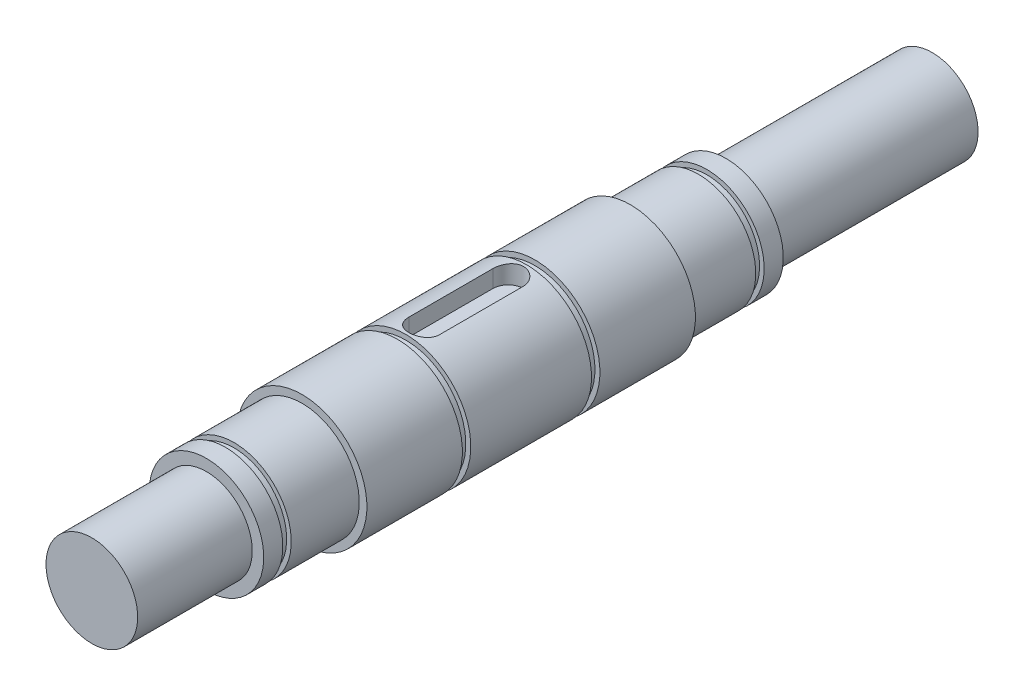
ISO-10303-21;
HEADER;
FILE_DESCRIPTION(('STEP AP214'),'2;1');
FILE_NAME('part.step','',(''),(''),'','','');
FILE_SCHEMA(('AUTOMOTIVE_DESIGN { 1 0 10303 214 1 1 1 1 }'));
ENDSEC;
DATA;
#1=APPLICATION_CONTEXT('core data for automotive mechanical design processes');
#2=APPLICATION_PROTOCOL_DEFINITION('international standard','automotive_design',2000,#1);
#3=PRODUCT_CONTEXT('',#1,'mechanical');
#4=PRODUCT('Part','Part','',(#3));
#5=PRODUCT_RELATED_PRODUCT_CATEGORY('part','',(#4));
#6=PRODUCT_DEFINITION_FORMATION('','',#4);
#7=PRODUCT_DEFINITION_CONTEXT('part definition',#1,'design');
#8=PRODUCT_DEFINITION('design','',#6,#7);
#9=PRODUCT_DEFINITION_SHAPE('','',#8);
#10=(LENGTH_UNIT() NAMED_UNIT(*) SI_UNIT(.MILLI.,.METRE.));
#11=(NAMED_UNIT(*) PLANE_ANGLE_UNIT() SI_UNIT($,.RADIAN.));
#12=(NAMED_UNIT(*) SI_UNIT($,.STERADIAN.) SOLID_ANGLE_UNIT());
#13=UNCERTAINTY_MEASURE_WITH_UNIT(LENGTH_MEASURE(1.E-05),#10,'distance_accuracy_value','');
#14=(GEOMETRIC_REPRESENTATION_CONTEXT(3) GLOBAL_UNCERTAINTY_ASSIGNED_CONTEXT((#13)) GLOBAL_UNIT_ASSIGNED_CONTEXT((#10,
#11,#12)) REPRESENTATION_CONTEXT('',''));
#15=CARTESIAN_POINT('',(0.,0.,0.));
#16=DIRECTION('',(0.,0.,1.));
#17=DIRECTION('',(1.,0.,0.));
#18=AXIS2_PLACEMENT_3D('',#15,#16,#17);
#19=CARTESIAN_POINT('',(0.,0.,61.));
#20=DIRECTION('',(0.,0.,-1.));
#21=DIRECTION('',(-1.,0.,0.));
#22=AXIS2_PLACEMENT_3D('',#19,#20,#21);
#23=CYLINDRICAL_SURFACE('',#22,8.5);
#24=DIRECTION('',(0.,0.,-1.));
#25=VECTOR('',#24,1.);
#26=CARTESIAN_POINT('',(2.00000000000001,8.26135582092915,61.));
#27=LINE('',#26,#25);
#28=CARTESIAN_POINT('',(2.,8.26135582092915,-5.5));
#29=VERTEX_POINT('',#28);
#30=CARTESIAN_POINT('',(2.,8.26135582092915,5.5));
#31=VERTEX_POINT('',#30);
#32=EDGE_CURVE('E11',#29,#31,#27,.F.);
#33=ORIENTED_EDGE('',*,*,#32,.T.);
#34=CARTESIAN_POINT('',(2.,8.26135582092915,5.5));
#35=CARTESIAN_POINT('',(2.00000055504916,8.26135236320292,5.55543443234609));
#36=CARTESIAN_POINT('',(1.99769380139236,8.2619144856103,5.61084150880542));
#37=CARTESIAN_POINT('',(1.98849731170137,8.264134056541,5.72124343398645));
#38=CARTESIAN_POINT('',(1.98160828133566,8.26579133641032,5.77623834486291));
#39=CARTESIAN_POINT('',(1.95416393612277,8.27234056234883,5.9397976249519));
#40=CARTESIAN_POINT('',(1.92683096321235,8.27881027991498,6.04724147136273));
#41=CARTESIAN_POINT('',(1.85496116677948,8.29520698466521,6.25585034596174));
#42=CARTESIAN_POINT('',(1.81042483664592,8.30513387269752,6.35701555412345));
#43=CARTESIAN_POINT('',(1.70546046419011,8.32732086336626,6.55048295176043));
#44=CARTESIAN_POINT('',(1.6450289846229,8.33958147049888,6.6427832183367));
#45=CARTESIAN_POINT('',(1.50874637759438,8.36531906602219,6.81764453044756));
#46=CARTESIAN_POINT('',(1.43264491321001,8.37881352706603,6.90000784641861));
#47=CARTESIAN_POINT('',(1.26771483694585,8.40534737590744,7.05093390496734));
#48=CARTESIAN_POINT('',(1.17888421755235,8.41838669151993,7.11949446660463));
#49=CARTESIAN_POINT('',(0.989672002747234,8.442733227235,7.24166094949367));
#50=CARTESIAN_POINT('',(0.889162184224322,8.45401726068056,7.2950732925612));
#51=CARTESIAN_POINT('',(0.680287309391546,8.47338148505523,7.38416960356757));
#52=CARTESIAN_POINT('',(0.571923680419546,8.48146225642124,7.41985678363482));
#53=CARTESIAN_POINT('',(0.352485313548638,8.49338596556868,7.47186163105777));
#54=CARTESIAN_POINT('',(0.241494636223669,8.49730265616028,7.48851679926374));
#55=CARTESIAN_POINT('',(0.0182275662118413,8.50071323920615,7.50304234200866));
#56=CARTESIAN_POINT('',(-0.0940486848647882,8.50020761420044,7.50091476602244));
#57=CARTESIAN_POINT('',(-0.314360678706203,8.49488597842209,7.47818142541676));
#58=CARTESIAN_POINT('',(-0.422436389839885,8.490154991221,7.45794013277813));
#59=CARTESIAN_POINT('',(-0.633611361576782,8.47701221926345,7.40013751637648));
#60=CARTESIAN_POINT('',(-0.736710417304362,8.46860028311536,7.36257548023524));
#61=CARTESIAN_POINT('',(-0.935993037737948,8.44890733460507,7.27088898107256));
#62=CARTESIAN_POINT('',(-1.03211256730711,8.43760323594277,7.21663049906744));
#63=CARTESIAN_POINT('',(-1.21400998738323,8.41335915429893,7.09319328328421));
#64=CARTESIAN_POINT('',(-1.29978653304345,8.40041895903104,7.02401261250253));
#65=CARTESIAN_POINT('',(-1.46072775473717,8.37395331213205,6.87073568992401));
#66=CARTESIAN_POINT('',(-1.53558950612902,8.36042126513727,6.78632223219044));
#67=CARTESIAN_POINT('',(-1.67017505039283,8.33458019092887,6.60597239998216));
#68=CARTESIAN_POINT('',(-1.72989470920645,8.32227149826905,6.51003288920577));
#69=CARTESIAN_POINT('',(-1.8326691841855,8.30024752435885,6.30879607738306));
#70=CARTESIAN_POINT('',(-1.87564929064842,8.29054392828406,6.20345934644367));
#71=CARTESIAN_POINT('',(-1.94314531697339,8.27498678101182,5.98683803286428));
#72=CARTESIAN_POINT('',(-1.96768876833645,8.26912749076621,5.87556258575516));
#73=CARTESIAN_POINT('',(-1.98841329263761,8.26415363873449,5.71945500793536));
#74=CARTESIAN_POINT('',(-1.99275932156623,8.26310592036969,5.67564612687529));
#75=CARTESIAN_POINT('',(-1.99854927861069,8.2617074132624,5.58789832699884));
#76=CARTESIAN_POINT('',(-1.99999797058451,8.26135548050657,5.54395974080035));
#77=CARTESIAN_POINT('',(-2.,8.26135582092915,5.5));
#78=B_SPLINE_CURVE_WITH_KNOTS('',3,(#34,#35,#36,#37,#38,#39,#40,#41,#42,#43,#44,#45,#46,#47,#48,
#49,#50,#51,#52,#53,#54,#55,#56,#57,#58,#59,#60,#61,#62,#63,#64,#65,#66,#67,#68,#69,#70,#71,#72,
#73,#74,#75,#76,#77),.UNSPECIFIED.,.F.,.F.,(4,2,2,2,2,2,2,2,2,2,2,2,2,2,2,2,2,2,2,2,2,4),(0.,
0.16619859764889,0.332371606715107,0.663814743733817,0.995248375734669,1.32675373757508,
1.66403554066599,2.00137059509772,2.34283993997873,2.6842473816804,3.01950170621968,
3.35471945001224,3.68334015893415,4.01197438477705,4.34331851400087,4.67470567990144,
5.01401985792581,5.35342657519617,5.69433118783424,6.03472570922612,6.1667548355018,
6.29856669785088),.UNSPECIFIED.);
#79=CARTESIAN_POINT('',(-2.,8.26135582092915,5.5));
#80=VERTEX_POINT('',#79);
#81=EDGE_CURVE('E183',#31,#80,#78,.T.);
#82=ORIENTED_EDGE('',*,*,#81,.T.);
#83=DIRECTION('',(0.,0.,-1.));
#84=VECTOR('',#83,1.);
#85=CARTESIAN_POINT('',(-1.99999999999999,8.26135582092915,61.));
#86=LINE('',#85,#84);
#87=CARTESIAN_POINT('',(-1.99999999999999,8.26135582092915,-5.50000000000001));
#88=VERTEX_POINT('',#87);
#89=EDGE_CURVE('E44',#80,#88,#86,.T.);
#90=ORIENTED_EDGE('',*,*,#89,.T.);
#91=CARTESIAN_POINT('',(-2.,8.26135582092915,-5.5));
#92=CARTESIAN_POINT('',(-2.00000055504917,8.26135236320292,-5.55543443234609));
#93=CARTESIAN_POINT('',(-1.99769380139237,8.2619144856103,-5.61084150880542));
#94=CARTESIAN_POINT('',(-1.98849731170137,8.264134056541,-5.72124343398645));
#95=CARTESIAN_POINT('',(-1.98160828133566,8.26579133641032,-5.77623834486291));
#96=CARTESIAN_POINT('',(-1.95416393612277,8.27234056234883,-5.9397976249519));
#97=CARTESIAN_POINT('',(-1.92683096321235,8.27881027991498,-6.04724147136273));
#98=CARTESIAN_POINT('',(-1.85496116677948,8.29520698466521,-6.25585034596174));
#99=CARTESIAN_POINT('',(-1.81042483664592,8.30513387269752,-6.35701555412345));
#100=CARTESIAN_POINT('',(-1.70546046419011,8.32732086336626,-6.55048295176042));
#101=CARTESIAN_POINT('',(-1.6450289846229,8.33958147049889,-6.6427832183367));
#102=CARTESIAN_POINT('',(-1.50874637759439,8.36531906602219,-6.81764453044755));
#103=CARTESIAN_POINT('',(-1.43264491321001,8.37881352706603,-6.90000784641861));
#104=CARTESIAN_POINT('',(-1.26771483694585,8.40534737590744,-7.05093390496734));
#105=CARTESIAN_POINT('',(-1.17888421755235,8.41838669151993,-7.11949446660463));
#106=CARTESIAN_POINT('',(-0.989672002747238,8.442733227235,-7.24166094949367));
#107=CARTESIAN_POINT('',(-0.889162184224326,8.45401726068056,-7.2950732925612));
#108=CARTESIAN_POINT('',(-0.680287309391551,8.47338148505523,-7.38416960356757));
#109=CARTESIAN_POINT('',(-0.57192368041955,8.48146225642124,-7.41985678363482));
#110=CARTESIAN_POINT('',(-0.352485313548643,8.49338596556868,-7.47186163105777));
#111=CARTESIAN_POINT('',(-0.241494636223674,8.49730265616028,-7.48851679926374));
#112=CARTESIAN_POINT('',(-0.0182275662118457,8.50071323920615,-7.50304234200866));
#113=CARTESIAN_POINT('',(0.0940486848647839,8.50020761420044,-7.50091476602244));
#114=CARTESIAN_POINT('',(0.314360678706199,8.49488597842209,-7.47818142541676));
#115=CARTESIAN_POINT('',(0.422436389839881,8.490154991221,-7.45794013277813));
#116=CARTESIAN_POINT('',(0.633611361576779,8.47701221926345,-7.40013751637648));
#117=CARTESIAN_POINT('',(0.736710417304359,8.46860028311537,-7.36257548023524));
#118=CARTESIAN_POINT('',(0.935993037737945,8.44890733460507,-7.27088898107256));
#119=CARTESIAN_POINT('',(1.03211256730711,8.43760323594277,-7.21663049906744));
#120=CARTESIAN_POINT('',(1.21400998738322,8.41335915429893,-7.09319328328421));
#121=CARTESIAN_POINT('',(1.29978653304345,8.40041895903104,-7.02401261250254));
#122=CARTESIAN_POINT('',(1.46072775473717,8.37395331213205,-6.87073568992401));
#123=CARTESIAN_POINT('',(1.53558950612902,8.36042126513727,-6.78632223219044));
#124=CARTESIAN_POINT('',(1.67017505039282,8.33458019092887,-6.60597239998216));
#125=CARTESIAN_POINT('',(1.72989470920644,8.32227149826905,-6.51003288920578));
#126=CARTESIAN_POINT('',(1.8326691841855,8.30024752435885,-6.30879607738307));
#127=CARTESIAN_POINT('',(1.87564929064842,8.29054392828406,-6.20345934644367));
#128=CARTESIAN_POINT('',(1.94314531697339,8.27498678101182,-5.98683803286428));
#129=CARTESIAN_POINT('',(1.96768876833644,8.26912749076621,-5.87556258575516));
#130=CARTESIAN_POINT('',(1.9884132926376,8.26415363873449,-5.71945500793537));
#131=CARTESIAN_POINT('',(1.99275932156623,8.26310592036969,-5.67564612687529));
#132=CARTESIAN_POINT('',(1.99854927861069,8.2617074132624,-5.58789832699884));
#133=CARTESIAN_POINT('',(1.99999797058451,8.26135548050657,-5.54395974080035));
#134=CARTESIAN_POINT('',(2.,8.26135582092915,-5.5));
#135=B_SPLINE_CURVE_WITH_KNOTS('',3,(#91,#92,#93,#94,#95,#96,#97,#98,#99,#100,#101,#102,#103,
#104,#105,#106,#107,#108,#109,#110,#111,#112,#113,#114,#115,#116,#117,#118,#119,#120,#121,#122,
#123,#124,#125,#126,#127,#128,#129,#130,#131,#132,#133,#134),.UNSPECIFIED.,.F.,.F.,(4,2,2,2,2,2,
2,2,2,2,2,2,2,2,2,2,2,2,2,2,2,4),(0.,0.166198597648889,0.332371606715107,0.663814743733816,
0.995248375734668,1.32675373757507,1.66403554066599,2.00137059509772,2.34283993997873,
2.6842473816804,3.01950170621968,3.35471945001224,3.68334015893415,4.01197438477705,
4.34331851400087,4.67470567990144,5.01401985792581,5.35342657519617,5.69433118783423,
6.03472570922612,6.16675483550179,6.29856669785088),.UNSPECIFIED.);
#136=EDGE_CURVE('E51',#88,#29,#135,.T.);
#137=ORIENTED_EDGE('',*,*,#136,.T.);
#138=EDGE_LOOP('',(#33,#82,#90,#137));
#139=FACE_BOUND('',#138,.T.);
#140=CARTESIAN_POINT('',(0.,0.,7.9));
#141=DIRECTION('',(0.,0.,-1.));
#142=DIRECTION('',(-1.,0.,0.));
#143=AXIS2_PLACEMENT_3D('',#140,#141,#142);
#144=CIRCLE('',#143,8.5);
#145=CARTESIAN_POINT('',(-8.5,0.,7.9));
#146=VERTEX_POINT('',#145);
#147=EDGE_CURVE('E102',#146,#146,#144,.T.);
#148=ORIENTED_EDGE('',*,*,#147,.T.);
#149=EDGE_LOOP('',(#148));
#150=FACE_BOUND('',#149,.T.);
#151=CARTESIAN_POINT('',(0.,0.,-7.9));
#152=DIRECTION('',(0.,0.,-1.));
#153=DIRECTION('',(-1.,0.,0.));
#154=AXIS2_PLACEMENT_3D('',#151,#152,#153);
#155=CIRCLE('',#154,8.5);
#156=CARTESIAN_POINT('',(-8.5,0.,-7.9));
#157=VERTEX_POINT('',#156);
#158=EDGE_CURVE('E117',#157,#157,#155,.T.);
#159=ORIENTED_EDGE('',*,*,#158,.F.);
#160=EDGE_LOOP('',(#159));
#161=FACE_BOUND('',#160,.T.);
#162=ADVANCED_FACE('F35',(#139,#150,#161),#23,.T.);
#163=CARTESIAN_POINT('',(0.,8.5,-7.9));
#164=DIRECTION('',(0.,0.,1.));
#165=DIRECTION('',(1.,0.,0.));
#166=AXIS2_PLACEMENT_3D('',#163,#164,#165);
#167=PLANE('',#166);
#168=CARTESIAN_POINT('',(0.,0.,-7.9));
#169=DIRECTION('',(0.,0.,-1.));
#170=DIRECTION('',(-1.,0.,0.));
#171=AXIS2_PLACEMENT_3D('',#168,#169,#170);
#172=CIRCLE('',#171,7.85);
#173=CARTESIAN_POINT('',(-7.85,0.,-7.9));
#174=VERTEX_POINT('',#173);
#175=EDGE_CURVE('E126',#174,#174,#172,.T.);
#176=ORIENTED_EDGE('',*,*,#175,.F.);
#177=EDGE_LOOP('',(#176));
#178=FACE_BOUND('',#177,.T.);
#179=ORIENTED_EDGE('',*,*,#158,.T.);
#180=EDGE_LOOP('',(#179));
#181=FACE_BOUND('',#180,.T.);
#182=ADVANCED_FACE('F232',(#178,#181),#167,.F.);
#183=CARTESIAN_POINT('',(0.,0.,-67.1));
#184=DIRECTION('',(0.,0.,-1.));
#185=DIRECTION('',(-1.,0.,0.));
#186=AXIS2_PLACEMENT_3D('',#183,#184,#185);
#187=CYLINDRICAL_SURFACE('',#186,7.85);
#188=CARTESIAN_POINT('',(0.,0.,-8.99999999999999));
#189=DIRECTION('',(0.,0.,-1.));
#190=DIRECTION('',(-1.,0.,0.));
#191=AXIS2_PLACEMENT_3D('',#188,#189,#190);
#192=CIRCLE('',#191,7.85);
#193=CARTESIAN_POINT('',(-7.85,0.,-8.99999999999999));
#194=VERTEX_POINT('',#193);
#195=EDGE_CURVE('E123',#194,#194,#192,.T.);
#196=ORIENTED_EDGE('',*,*,#195,.F.);
#197=EDGE_LOOP('',(#196));
#198=FACE_BOUND('',#197,.T.);
#199=ORIENTED_EDGE('',*,*,#175,.T.);
#200=EDGE_LOOP('',(#199));
#201=FACE_BOUND('',#200,.T.);
#202=ADVANCED_FACE('F228',(#198,#201),#187,.T.);
#203=CARTESIAN_POINT('',(0.,8.5,-9.));
#204=DIRECTION('',(0.,0.,-1.));
#205=DIRECTION('',(-1.,0.,0.));
#206=AXIS2_PLACEMENT_3D('',#203,#204,#205);
#207=PLANE('',#206);
#208=CARTESIAN_POINT('',(0.,0.,-8.99999999999999));
#209=DIRECTION('',(0.,0.,-1.));
#210=DIRECTION('',(-1.,0.,0.));
#211=AXIS2_PLACEMENT_3D('',#208,#209,#210);
#212=CIRCLE('',#211,8.5);
#213=CARTESIAN_POINT('',(-8.5,0.,-8.99999999999999));
#214=VERTEX_POINT('',#213);
#215=EDGE_CURVE('E120',#214,#214,#212,.T.);
#216=ORIENTED_EDGE('',*,*,#215,.F.);
#217=EDGE_LOOP('',(#216));
#218=FACE_BOUND('',#217,.T.);
#219=ORIENTED_EDGE('',*,*,#195,.T.);
#220=EDGE_LOOP('',(#219));
#221=FACE_BOUND('',#220,.T.);
#222=ADVANCED_FACE('F224',(#218,#221),#207,.F.);
#223=CARTESIAN_POINT('',(0.,0.,-61.));
#224=DIRECTION('',(0.,0.,1.));
#225=DIRECTION('',(1.,0.,0.));
#226=AXIS2_PLACEMENT_3D('',#223,#224,#225);
#227=PLANE('',#226);
#228=CARTESIAN_POINT('',(0.,0.,-61.));
#229=DIRECTION('',(0.,0.,-1.));
#230=DIRECTION('',(-1.,0.,0.));
#231=AXIS2_PLACEMENT_3D('',#228,#229,#230);
#232=CIRCLE('',#231,6.);
#233=CARTESIAN_POINT('',(-6.,0.,-61.));
#234=VERTEX_POINT('',#233);
#235=EDGE_CURVE('E162',#234,#234,#232,.T.);
#236=ORIENTED_EDGE('',*,*,#235,.T.);
#237=EDGE_LOOP('',(#236));
#238=FACE_BOUND('',#237,.T.);
#239=ADVANCED_FACE('F227',(#238),#227,.F.);
#240=CARTESIAN_POINT('',(0.,0.,-67.1));
#241=DIRECTION('',(0.,0.,-1.));
#242=DIRECTION('',(-1.,0.,0.));
#243=AXIS2_PLACEMENT_3D('',#240,#241,#242);
#244=CYLINDRICAL_SURFACE('',#243,6.);
#245=ORIENTED_EDGE('',*,*,#235,.F.);
#246=EDGE_LOOP('',(#245));
#247=FACE_BOUND('',#246,.T.);
#248=CARTESIAN_POINT('',(0.,0.,-34.));
#249=DIRECTION('',(0.,0.,-1.));
#250=DIRECTION('',(-1.,0.,0.));
#251=AXIS2_PLACEMENT_3D('',#248,#249,#250);
#252=CIRCLE('',#251,6.);
#253=CARTESIAN_POINT('',(-6.,0.,-34.));
#254=VERTEX_POINT('',#253);
#255=EDGE_CURVE('E165',#254,#254,#252,.T.);
#256=ORIENTED_EDGE('',*,*,#255,.T.);
#257=EDGE_LOOP('',(#256));
#258=FACE_BOUND('',#257,.T.);
#259=ADVANCED_FACE('F272',(#247,#258),#244,.T.);
#260=CARTESIAN_POINT('',(0.,7.5,-34.));
#261=DIRECTION('',(0.,0.,1.));
#262=DIRECTION('',(1.,0.,0.));
#263=AXIS2_PLACEMENT_3D('',#260,#261,#262);
#264=PLANE('',#263);
#265=ORIENTED_EDGE('',*,*,#255,.F.);
#266=EDGE_LOOP('',(#265));
#267=FACE_BOUND('',#266,.T.);
#268=CARTESIAN_POINT('',(0.,0.,-34.));
#269=DIRECTION('',(0.,0.,-1.));
#270=DIRECTION('',(-1.,0.,0.));
#271=AXIS2_PLACEMENT_3D('',#268,#269,#270);
#272=CIRCLE('',#271,7.5);
#273=CARTESIAN_POINT('',(-7.5,0.,-34.));
#274=VERTEX_POINT('',#273);
#275=EDGE_CURVE('E159',#274,#274,#272,.T.);
#276=ORIENTED_EDGE('',*,*,#275,.T.);
#277=EDGE_LOOP('',(#276));
#278=FACE_BOUND('',#277,.T.);
#279=ADVANCED_FACE('F275',(#267,#278),#264,.F.);
#280=CARTESIAN_POINT('',(0.,0.,-67.1));
#281=DIRECTION('',(0.,0.,-1.));
#282=DIRECTION('',(-1.,0.,0.));
#283=AXIS2_PLACEMENT_3D('',#280,#281,#282);
#284=CYLINDRICAL_SURFACE('',#283,7.5);
#285=CARTESIAN_POINT('',(0.,0.,-31.5));
#286=DIRECTION('',(0.,0.,-1.));
#287=DIRECTION('',(-1.,0.,0.));
#288=AXIS2_PLACEMENT_3D('',#285,#286,#287);
#289=CIRCLE('',#288,7.5);
#290=CARTESIAN_POINT('',(-7.5,0.,-31.5));
#291=VERTEX_POINT('',#290);
#292=EDGE_CURVE('E144',#291,#291,#289,.T.);
#293=ORIENTED_EDGE('',*,*,#292,.T.);
#294=EDGE_LOOP('',(#293));
#295=FACE_BOUND('',#294,.T.);
#296=ORIENTED_EDGE('',*,*,#275,.F.);
#297=EDGE_LOOP('',(#296));
#298=FACE_BOUND('',#297,.T.);
#299=ADVANCED_FACE('F255',(#295,#298),#284,.T.);
#300=CARTESIAN_POINT('',(0.,7.5,-31.5));
#301=DIRECTION('',(0.,0.,-1.));
#302=DIRECTION('',(-1.,0.,0.));
#303=AXIS2_PLACEMENT_3D('',#300,#301,#302);
#304=PLANE('',#303);
#305=ORIENTED_EDGE('',*,*,#292,.F.);
#306=EDGE_LOOP('',(#305));
#307=FACE_BOUND('',#306,.T.);
#308=CARTESIAN_POINT('',(0.,0.,-31.5));
#309=DIRECTION('',(0.,0.,-1.));
#310=DIRECTION('',(-1.,0.,0.));
#311=AXIS2_PLACEMENT_3D('',#308,#309,#310);
#312=CIRCLE('',#311,6.9);
#313=CARTESIAN_POINT('',(-6.9,0.,-31.5));
#314=VERTEX_POINT('',#313);
#315=EDGE_CURVE('E147',#314,#314,#312,.T.);
#316=ORIENTED_EDGE('',*,*,#315,.T.);
#317=EDGE_LOOP('',(#316));
#318=FACE_BOUND('',#317,.T.);
#319=ADVANCED_FACE('F251',(#307,#318),#304,.F.);
#320=CARTESIAN_POINT('',(0.,0.,-67.1));
#321=DIRECTION('',(0.,0.,-1.));
#322=DIRECTION('',(-1.,0.,0.));
#323=AXIS2_PLACEMENT_3D('',#320,#321,#322);
#324=CYLINDRICAL_SURFACE('',#323,6.9);
#325=ORIENTED_EDGE('',*,*,#315,.F.);
#326=EDGE_LOOP('',(#325));
#327=FACE_BOUND('',#326,.T.);
#328=CARTESIAN_POINT('',(0.,0.,-30.4));
#329=DIRECTION('',(0.,0.,-1.));
#330=DIRECTION('',(-1.,0.,0.));
#331=AXIS2_PLACEMENT_3D('',#328,#329,#330);
#332=CIRCLE('',#331,6.9);
#333=CARTESIAN_POINT('',(-6.9,0.,-30.4));
#334=VERTEX_POINT('',#333);
#335=EDGE_CURVE('E150',#334,#334,#332,.T.);
#336=ORIENTED_EDGE('',*,*,#335,.T.);
#337=EDGE_LOOP('',(#336));
#338=FACE_BOUND('',#337,.T.);
#339=ADVANCED_FACE('F254',(#327,#338),#324,.T.);
#340=CARTESIAN_POINT('',(0.,7.5,-30.4));
#341=DIRECTION('',(0.,0.,1.));
#342=DIRECTION('',(1.,0.,0.));
#343=AXIS2_PLACEMENT_3D('',#340,#341,#342);
#344=PLANE('',#343);
#345=ORIENTED_EDGE('',*,*,#335,.F.);
#346=EDGE_LOOP('',(#345));
#347=FACE_BOUND('',#346,.T.);
#348=CARTESIAN_POINT('',(0.,0.,-30.4));
#349=DIRECTION('',(0.,0.,-1.));
#350=DIRECTION('',(-1.,0.,0.));
#351=AXIS2_PLACEMENT_3D('',#348,#349,#350);
#352=CIRCLE('',#351,7.5);
#353=CARTESIAN_POINT('',(-7.5,0.,-30.4));
#354=VERTEX_POINT('',#353);
#355=EDGE_CURVE('E141',#354,#354,#352,.T.);
#356=ORIENTED_EDGE('',*,*,#355,.T.);
#357=EDGE_LOOP('',(#356));
#358=FACE_BOUND('',#357,.T.);
#359=ADVANCED_FACE('F259',(#347,#358),#344,.F.);
#360=ORIENTED_EDGE('',*,*,#355,.F.);
#361=EDGE_LOOP('',(#360));
#362=FACE_BOUND('',#361,.T.);
#363=CARTESIAN_POINT('',(0.,0.,-21.5));
#364=DIRECTION('',(0.,0.,-1.));
#365=DIRECTION('',(-1.,0.,0.));
#366=AXIS2_PLACEMENT_3D('',#363,#364,#365);
#367=CIRCLE('',#366,7.5);
#368=CARTESIAN_POINT('',(-7.5,0.,-21.5));
#369=VERTEX_POINT('',#368);
#370=EDGE_CURVE('E177',#369,#369,#367,.T.);
#371=ORIENTED_EDGE('',*,*,#370,.T.);
#372=EDGE_LOOP('',(#371));
#373=FACE_BOUND('',#372,.T.);
#374=ADVANCED_FACE('F263',(#362,#373),#284,.T.);
#375=CARTESIAN_POINT('',(0.,8.5,-21.5));
#376=DIRECTION('',(0.,0.,1.));
#377=DIRECTION('',(1.,0.,0.));
#378=AXIS2_PLACEMENT_3D('',#375,#376,#377);
#379=PLANE('',#378);
#380=ORIENTED_EDGE('',*,*,#370,.F.);
#381=EDGE_LOOP('',(#380));
#382=FACE_BOUND('',#381,.T.);
#383=CARTESIAN_POINT('',(0.,0.,-21.5));
#384=DIRECTION('',(0.,0.,-1.));
#385=DIRECTION('',(-1.,0.,0.));
#386=AXIS2_PLACEMENT_3D('',#383,#384,#385);
#387=CIRCLE('',#386,8.5);
#388=CARTESIAN_POINT('',(-8.5,0.,-21.5));
#389=VERTEX_POINT('',#388);
#390=EDGE_CURVE('E174',#389,#389,#387,.T.);
#391=ORIENTED_EDGE('',*,*,#390,.T.);
#392=EDGE_LOOP('',(#391));
#393=FACE_BOUND('',#392,.T.);
#394=ADVANCED_FACE('F290',(#382,#393),#379,.F.);
#395=CARTESIAN_POINT('',(-8.5,0.,-8.99999999999999));
#396=CARTESIAN_POINT('',(-8.5,0.,-9.13020833333333));
#397=CARTESIAN_POINT('',(-8.5,0.,-9.26041666666666));
#398=CARTESIAN_POINT('',(-8.5,0.,-9.52083333333333));
#399=CARTESIAN_POINT('',(-8.5,0.,-9.65104166666666));
#400=CARTESIAN_POINT('',(-8.5,0.,-9.91145833333333));
#401=CARTESIAN_POINT('',(-8.5,0.,-10.0416666666667));
#402=CARTESIAN_POINT('',(-8.5,0.,-10.3020833333333));
#403=CARTESIAN_POINT('',(-8.5,0.,-10.4322916666667));
#404=CARTESIAN_POINT('',(-8.5,0.,-10.6927083333333));
#405=CARTESIAN_POINT('',(-8.5,0.,-10.8229166666667));
#406=CARTESIAN_POINT('',(-8.5,0.,-11.0833333333333));
#407=CARTESIAN_POINT('',(-8.5,0.,-11.2135416666667));
#408=CARTESIAN_POINT('',(-8.5,0.,-11.4739583333333));
#409=CARTESIAN_POINT('',(-8.5,0.,-11.6041666666667));
#410=CARTESIAN_POINT('',(-8.5,0.,-11.8645833333333));
#411=CARTESIAN_POINT('',(-8.5,0.,-11.9947916666667));
#412=CARTESIAN_POINT('',(-8.5,0.,-12.2552083333333));
#413=CARTESIAN_POINT('',(-8.5,0.,-12.3854166666667));
#414=CARTESIAN_POINT('',(-8.5,0.,-12.6458333333333));
#415=CARTESIAN_POINT('',(-8.5,0.,-12.7760416666667));
#416=CARTESIAN_POINT('',(-8.5,0.,-13.0364583333333));
#417=CARTESIAN_POINT('',(-8.5,0.,-13.1666666666667));
#418=CARTESIAN_POINT('',(-8.5,0.,-13.4270833333333));
#419=CARTESIAN_POINT('',(-8.5,0.,-13.5572916666667));
#420=CARTESIAN_POINT('',(-8.5,0.,-13.8177083333333));
#421=CARTESIAN_POINT('',(-8.5,0.,-13.9479166666667));
#422=CARTESIAN_POINT('',(-8.5,0.,-14.2083333333333));
#423=CARTESIAN_POINT('',(-8.5,0.,-14.3385416666667));
#424=CARTESIAN_POINT('',(-8.5,0.,-14.5989583333333));
#425=CARTESIAN_POINT('',(-8.5,0.,-14.7291666666667));
#426=CARTESIAN_POINT('',(-8.5,0.,-14.9895833333333));
#427=CARTESIAN_POINT('',(-8.5,0.,-15.1197916666667));
#428=CARTESIAN_POINT('',(-8.5,0.,-15.3802083333333));
#429=CARTESIAN_POINT('',(-8.5,0.,-15.5104166666667));
#430=CARTESIAN_POINT('',(-8.5,0.,-15.7708333333333));
#431=CARTESIAN_POINT('',(-8.5,0.,-15.9010416666667));
#432=CARTESIAN_POINT('',(-8.5,0.,-16.1614583333333));
#433=CARTESIAN_POINT('',(-8.5,0.,-16.2916666666667));
#434=CARTESIAN_POINT('',(-8.5,0.,-16.5520833333333));
#435=CARTESIAN_POINT('',(-8.5,0.,-16.6822916666667));
#436=CARTESIAN_POINT('',(-8.5,0.,-16.9427083333333));
#437=CARTESIAN_POINT('',(-8.5,0.,-17.0729166666667));
#438=CARTESIAN_POINT('',(-8.5,0.,-17.3333333333333));
#439=CARTESIAN_POINT('',(-8.5,0.,-17.4635416666667));
#440=CARTESIAN_POINT('',(-8.5,0.,-17.7239583333333));
#441=CARTESIAN_POINT('',(-8.5,0.,-17.8541666666667));
#442=CARTESIAN_POINT('',(-8.5,0.,-18.1145833333333));
#443=CARTESIAN_POINT('',(-8.5,0.,-18.2447916666667));
#444=CARTESIAN_POINT('',(-8.5,0.,-18.5052083333333));
#445=CARTESIAN_POINT('',(-8.5,0.,-18.6354166666667));
#446=CARTESIAN_POINT('',(-8.5,0.,-18.8958333333333));
#447=CARTESIAN_POINT('',(-8.5,0.,-19.0260416666667));
#448=CARTESIAN_POINT('',(-8.5,0.,-19.2864583333333));
#449=CARTESIAN_POINT('',(-8.5,0.,-19.4166666666667));
#450=CARTESIAN_POINT('',(-8.5,0.,-19.6770833333333));
#451=CARTESIAN_POINT('',(-8.5,0.,-19.8072916666667));
#452=CARTESIAN_POINT('',(-8.5,0.,-20.0677083333333));
#453=CARTESIAN_POINT('',(-8.5,0.,-20.1979166666667));
#454=CARTESIAN_POINT('',(-8.5,0.,-20.4583333333333));
#455=CARTESIAN_POINT('',(-8.5,0.,-20.5885416666667));
#456=CARTESIAN_POINT('',(-8.5,0.,-20.8489583333333));
#457=CARTESIAN_POINT('',(-8.5,0.,-20.9791666666667));
#458=CARTESIAN_POINT('',(-8.5,0.,-21.2395833333333));
#459=CARTESIAN_POINT('',(-8.5,0.,-21.3697916666667));
#460=CARTESIAN_POINT('',(-8.5,0.,-21.5));
#461=B_SPLINE_CURVE_WITH_KNOTS('',3,(#395,#396,#397,#398,#399,#400,#401,#402,#403,#404,#405,
#406,#407,#408,#409,#410,#411,#412,#413,#414,#415,#416,#417,#418,#419,#420,#421,#422,#423,#424,
#425,#426,#427,#428,#429,#430,#431,#432,#433,#434,#435,#436,#437,#438,#439,#440,#441,#442,#443,
#444,#445,#446,#447,#448,#449,#450,#451,#452,#453,#454,#455,#456,#457,#458,#459,#460),
.UNSPECIFIED.,.F.,.F.,(4,2,2,2,2,2,2,2,2,2,2,2,2,2,2,2,2,2,2,2,2,2,2,2,2,2,2,2,2,2,2,2,4),(0.,
0.390625000000006,0.781249999999997,1.171875,1.56249999999999,1.953125,2.34375000000001,
2.734375,3.125,3.51562500000001,3.90625,4.29687500000001,4.68750000000001,5.078125,
5.46875000000001,5.859375,6.25000000000001,6.64062500000001,7.03125,7.42187500000001,7.8125,
8.20312500000001,8.59375000000001,8.984375,9.37500000000001,9.76562500000001,10.15625,10.546875,
10.9375,11.328125,11.71875,12.109375,12.5),.UNSPECIFIED.);
#462=EDGE_CURVE('BSEAM37',#214,#389,#461,.T.);
#463=ORIENTED_EDGE('',*,*,#215,.T.);
#464=ORIENTED_EDGE('',*,*,#390,.F.);
#465=ORIENTED_EDGE('',*,*,#462,.T.);
#466=ORIENTED_EDGE('',*,*,#462,.F.);
#467=EDGE_LOOP('',(#463,#465,#464,#466));
#468=FACE_BOUND('',#467,.T.);
#469=ADVANCED_FACE('F37',(#468),#23,.T.);
#470=CARTESIAN_POINT('',(0.,8.5,7.9));
#471=DIRECTION('',(0.,0.,-1.));
#472=DIRECTION('',(1.,0.,0.));
#473=AXIS2_PLACEMENT_3D('',#470,#471,#472);
#474=PLANE('',#473);
#475=CARTESIAN_POINT('',(0.,0.,7.9));
#476=DIRECTION('',(0.,0.,-1.));
#477=DIRECTION('',(-1.,0.,0.));
#478=AXIS2_PLACEMENT_3D('',#475,#476,#477);
#479=CIRCLE('',#478,7.85);
#480=CARTESIAN_POINT('',(-7.85,0.,7.9));
#481=VERTEX_POINT('',#480);
#482=EDGE_CURVE('E114',#481,#481,#479,.T.);
#483=ORIENTED_EDGE('',*,*,#482,.T.);
#484=EDGE_LOOP('',(#483));
#485=FACE_BOUND('',#484,.T.);
#486=ORIENTED_EDGE('',*,*,#147,.F.);
#487=EDGE_LOOP('',(#486));
#488=FACE_BOUND('',#487,.T.);
#489=ADVANCED_FACE('F219',(#485,#488),#474,.F.);
#490=CARTESIAN_POINT('',(0.,0.,67.1));
#491=DIRECTION('',(0.,0.,1.));
#492=DIRECTION('',(-1.,0.,0.));
#493=AXIS2_PLACEMENT_3D('',#490,#491,#492);
#494=CYLINDRICAL_SURFACE('',#493,7.85);
#495=CARTESIAN_POINT('',(0.,0.,8.99999999999999));
#496=DIRECTION('',(0.,0.,-1.));
#497=DIRECTION('',(-1.,0.,0.));
#498=AXIS2_PLACEMENT_3D('',#495,#496,#497);
#499=CIRCLE('',#498,7.85);
#500=CARTESIAN_POINT('',(-7.85,0.,8.99999999999999));
#501=VERTEX_POINT('',#500);
#502=EDGE_CURVE('E111',#501,#501,#499,.T.);
#503=ORIENTED_EDGE('',*,*,#502,.T.);
#504=EDGE_LOOP('',(#503));
#505=FACE_BOUND('',#504,.T.);
#506=ORIENTED_EDGE('',*,*,#482,.F.);
#507=EDGE_LOOP('',(#506));
#508=FACE_BOUND('',#507,.T.);
#509=ADVANCED_FACE('F215',(#505,#508),#494,.T.);
#510=CARTESIAN_POINT('',(0.,8.5,9.));
#511=DIRECTION('',(0.,0.,1.));
#512=DIRECTION('',(-1.,0.,0.));
#513=AXIS2_PLACEMENT_3D('',#510,#511,#512);
#514=PLANE('',#513);
#515=CARTESIAN_POINT('',(0.,0.,8.99999999999999));
#516=DIRECTION('',(0.,0.,-1.));
#517=DIRECTION('',(-1.,0.,0.));
#518=AXIS2_PLACEMENT_3D('',#515,#516,#517);
#519=CIRCLE('',#518,8.5);
#520=CARTESIAN_POINT('',(-8.5,0.,9.));
#521=VERTEX_POINT('',#520);
#522=EDGE_CURVE('E108',#521,#521,#519,.T.);
#523=ORIENTED_EDGE('',*,*,#522,.T.);
#524=EDGE_LOOP('',(#523));
#525=FACE_BOUND('',#524,.T.);
#526=ORIENTED_EDGE('',*,*,#502,.F.);
#527=EDGE_LOOP('',(#526));
#528=FACE_BOUND('',#527,.T.);
#529=ADVANCED_FACE('F211',(#525,#528),#514,.F.);
#530=CARTESIAN_POINT('',(0.,0.,67.1));
#531=DIRECTION('',(0.,0.,1.));
#532=DIRECTION('',(-1.,0.,0.));
#533=AXIS2_PLACEMENT_3D('',#530,#531,#532);
#534=CYLINDRICAL_SURFACE('',#533,6.);
#535=CARTESIAN_POINT('',(0.,0.,49.));
#536=DIRECTION('',(0.,0.,-1.));
#537=DIRECTION('',(-1.,0.,0.));
#538=AXIS2_PLACEMENT_3D('',#535,#536,#537);
#539=CIRCLE('',#538,6.);
#540=CARTESIAN_POINT('',(-6.,0.,49.));
#541=VERTEX_POINT('',#540);
#542=EDGE_CURVE('E180',#541,#541,#539,.T.);
#543=ORIENTED_EDGE('',*,*,#542,.T.);
#544=EDGE_LOOP('',(#543));
#545=FACE_BOUND('',#544,.T.);
#546=CARTESIAN_POINT('',(0.,0.,34.));
#547=DIRECTION('',(0.,0.,-1.));
#548=DIRECTION('',(-1.,0.,0.));
#549=AXIS2_PLACEMENT_3D('',#546,#547,#548);
#550=CIRCLE('',#549,6.);
#551=CARTESIAN_POINT('',(-6.,0.,34.));
#552=VERTEX_POINT('',#551);
#553=EDGE_CURVE('E156',#552,#552,#550,.T.);
#554=ORIENTED_EDGE('',*,*,#553,.F.);
#555=EDGE_LOOP('',(#554));
#556=FACE_BOUND('',#555,.T.);
#557=ADVANCED_FACE('F214',(#545,#556),#534,.T.);
#558=CARTESIAN_POINT('',(0.,7.5,34.));
#559=DIRECTION('',(0.,0.,-1.));
#560=DIRECTION('',(1.,0.,0.));
#561=AXIS2_PLACEMENT_3D('',#558,#559,#560);
#562=PLANE('',#561);
#563=ORIENTED_EDGE('',*,*,#553,.T.);
#564=EDGE_LOOP('',(#563));
#565=FACE_BOUND('',#564,.T.);
#566=CARTESIAN_POINT('',(0.,0.,34.));
#567=DIRECTION('',(0.,0.,-1.));
#568=DIRECTION('',(-1.,0.,0.));
#569=AXIS2_PLACEMENT_3D('',#566,#567,#568);
#570=CIRCLE('',#569,7.5);
#571=CARTESIAN_POINT('',(-7.5,0.,34.));
#572=VERTEX_POINT('',#571);
#573=EDGE_CURVE('E153',#572,#572,#570,.T.);
#574=ORIENTED_EDGE('',*,*,#573,.F.);
#575=EDGE_LOOP('',(#574));
#576=FACE_BOUND('',#575,.T.);
#577=ADVANCED_FACE('F267',(#565,#576),#562,.F.);
#578=CARTESIAN_POINT('',(0.,0.,67.1));
#579=DIRECTION('',(0.,0.,1.));
#580=DIRECTION('',(-1.,0.,0.));
#581=AXIS2_PLACEMENT_3D('',#578,#579,#580);
#582=CYLINDRICAL_SURFACE('',#581,7.5);
#583=CARTESIAN_POINT('',(0.,0.,31.5));
#584=DIRECTION('',(0.,0.,-1.));
#585=DIRECTION('',(-1.,0.,0.));
#586=AXIS2_PLACEMENT_3D('',#583,#584,#585);
#587=CIRCLE('',#586,7.5);
#588=CARTESIAN_POINT('',(-7.5,0.,31.5));
#589=VERTEX_POINT('',#588);
#590=EDGE_CURVE('E132',#589,#589,#587,.T.);
#591=ORIENTED_EDGE('',*,*,#590,.F.);
#592=EDGE_LOOP('',(#591));
#593=FACE_BOUND('',#592,.T.);
#594=ORIENTED_EDGE('',*,*,#573,.T.);
#595=EDGE_LOOP('',(#594));
#596=FACE_BOUND('',#595,.T.);
#597=ADVANCED_FACE('F241',(#593,#596),#582,.T.);
#598=CARTESIAN_POINT('',(0.,7.5,31.5));
#599=DIRECTION('',(0.,0.,1.));
#600=DIRECTION('',(-1.,0.,0.));
#601=AXIS2_PLACEMENT_3D('',#598,#599,#600);
#602=PLANE('',#601);
#603=ORIENTED_EDGE('',*,*,#590,.T.);
#604=EDGE_LOOP('',(#603));
#605=FACE_BOUND('',#604,.T.);
#606=CARTESIAN_POINT('',(0.,0.,31.5));
#607=DIRECTION('',(0.,0.,-1.));
#608=DIRECTION('',(-1.,0.,0.));
#609=AXIS2_PLACEMENT_3D('',#606,#607,#608);
#610=CIRCLE('',#609,6.9);
#611=CARTESIAN_POINT('',(-6.9,0.,31.5));
#612=VERTEX_POINT('',#611);
#613=EDGE_CURVE('E135',#612,#612,#610,.T.);
#614=ORIENTED_EDGE('',*,*,#613,.F.);
#615=EDGE_LOOP('',(#614));
#616=FACE_BOUND('',#615,.T.);
#617=ADVANCED_FACE('F237',(#605,#616),#602,.F.);
#618=CARTESIAN_POINT('',(0.,0.,67.1));
#619=DIRECTION('',(0.,0.,1.));
#620=DIRECTION('',(-1.,0.,0.));
#621=AXIS2_PLACEMENT_3D('',#618,#619,#620);
#622=CYLINDRICAL_SURFACE('',#621,6.9);
#623=ORIENTED_EDGE('',*,*,#613,.T.);
#624=EDGE_LOOP('',(#623));
#625=FACE_BOUND('',#624,.T.);
#626=CARTESIAN_POINT('',(0.,0.,30.4));
#627=DIRECTION('',(0.,0.,-1.));
#628=DIRECTION('',(-1.,0.,0.));
#629=AXIS2_PLACEMENT_3D('',#626,#627,#628);
#630=CIRCLE('',#629,6.9);
#631=CARTESIAN_POINT('',(-6.9,0.,30.4));
#632=VERTEX_POINT('',#631);
#633=EDGE_CURVE('E138',#632,#632,#630,.T.);
#634=ORIENTED_EDGE('',*,*,#633,.F.);
#635=EDGE_LOOP('',(#634));
#636=FACE_BOUND('',#635,.T.);
#637=ADVANCED_FACE('F240',(#625,#636),#622,.T.);
#638=CARTESIAN_POINT('',(0.,7.5,30.4));
#639=DIRECTION('',(0.,0.,-1.));
#640=DIRECTION('',(1.,0.,0.));
#641=AXIS2_PLACEMENT_3D('',#638,#639,#640);
#642=PLANE('',#641);
#643=ORIENTED_EDGE('',*,*,#633,.T.);
#644=EDGE_LOOP('',(#643));
#645=FACE_BOUND('',#644,.T.);
#646=CARTESIAN_POINT('',(0.,0.,30.4));
#647=DIRECTION('',(0.,0.,-1.));
#648=DIRECTION('',(-1.,0.,0.));
#649=AXIS2_PLACEMENT_3D('',#646,#647,#648);
#650=CIRCLE('',#649,7.5);
#651=CARTESIAN_POINT('',(-7.5,0.,30.4));
#652=VERTEX_POINT('',#651);
#653=EDGE_CURVE('E129',#652,#652,#650,.T.);
#654=ORIENTED_EDGE('',*,*,#653,.F.);
#655=EDGE_LOOP('',(#654));
#656=FACE_BOUND('',#655,.T.);
#657=ADVANCED_FACE('F245',(#645,#656),#642,.F.);
#658=ORIENTED_EDGE('',*,*,#653,.T.);
#659=EDGE_LOOP('',(#658));
#660=FACE_BOUND('',#659,.T.);
#661=CARTESIAN_POINT('',(0.,0.,21.5));
#662=DIRECTION('',(0.,0.,-1.));
#663=DIRECTION('',(-1.,0.,0.));
#664=AXIS2_PLACEMENT_3D('',#661,#662,#663);
#665=CIRCLE('',#664,7.5);
#666=CARTESIAN_POINT('',(-7.5,0.,21.5));
#667=VERTEX_POINT('',#666);
#668=EDGE_CURVE('E171',#667,#667,#665,.T.);
#669=ORIENTED_EDGE('',*,*,#668,.F.);
#670=EDGE_LOOP('',(#669));
#671=FACE_BOUND('',#670,.T.);
#672=ADVANCED_FACE('F249',(#660,#671),#582,.T.);
#673=CARTESIAN_POINT('',(0.,8.5,21.5));
#674=DIRECTION('',(0.,0.,-1.));
#675=DIRECTION('',(1.,0.,0.));
#676=AXIS2_PLACEMENT_3D('',#673,#674,#675);
#677=PLANE('',#676);
#678=ORIENTED_EDGE('',*,*,#668,.T.);
#679=EDGE_LOOP('',(#678));
#680=FACE_BOUND('',#679,.T.);
#681=CARTESIAN_POINT('',(0.,0.,21.5));
#682=DIRECTION('',(0.,0.,-1.));
#683=DIRECTION('',(-1.,0.,0.));
#684=AXIS2_PLACEMENT_3D('',#681,#682,#683);
#685=CIRCLE('',#684,8.5);
#686=CARTESIAN_POINT('',(-8.5,0.,21.5));
#687=VERTEX_POINT('',#686);
#688=EDGE_CURVE('E168',#687,#687,#685,.T.);
#689=ORIENTED_EDGE('',*,*,#688,.F.);
#690=EDGE_LOOP('',(#689));
#691=FACE_BOUND('',#690,.T.);
#692=ADVANCED_FACE('F283',(#680,#691),#677,.F.);
#693=CARTESIAN_POINT('',(-8.5,0.,9.));
#694=CARTESIAN_POINT('',(-8.5,0.,9.13020833333333));
#695=CARTESIAN_POINT('',(-8.5,0.,9.26041666666667));
#696=CARTESIAN_POINT('',(-8.5,0.,9.52083333333333));
#697=CARTESIAN_POINT('',(-8.5,0.,9.65104166666667));
#698=CARTESIAN_POINT('',(-8.5,0.,9.91145833333333));
#699=CARTESIAN_POINT('',(-8.5,0.,10.0416666666667));
#700=CARTESIAN_POINT('',(-8.5,0.,10.3020833333333));
#701=CARTESIAN_POINT('',(-8.5,0.,10.4322916666667));
#702=CARTESIAN_POINT('',(-8.5,0.,10.6927083333333));
#703=CARTESIAN_POINT('',(-8.5,0.,10.8229166666667));
#704=CARTESIAN_POINT('',(-8.5,0.,11.0833333333333));
#705=CARTESIAN_POINT('',(-8.5,0.,11.2135416666667));
#706=CARTESIAN_POINT('',(-8.5,0.,11.4739583333333));
#707=CARTESIAN_POINT('',(-8.5,0.,11.6041666666667));
#708=CARTESIAN_POINT('',(-8.5,0.,11.8645833333333));
#709=CARTESIAN_POINT('',(-8.5,0.,11.9947916666667));
#710=CARTESIAN_POINT('',(-8.5,0.,12.2552083333333));
#711=CARTESIAN_POINT('',(-8.5,0.,12.3854166666667));
#712=CARTESIAN_POINT('',(-8.5,0.,12.6458333333333));
#713=CARTESIAN_POINT('',(-8.5,0.,12.7760416666667));
#714=CARTESIAN_POINT('',(-8.5,0.,13.0364583333333));
#715=CARTESIAN_POINT('',(-8.5,0.,13.1666666666667));
#716=CARTESIAN_POINT('',(-8.5,0.,13.4270833333333));
#717=CARTESIAN_POINT('',(-8.5,0.,13.5572916666667));
#718=CARTESIAN_POINT('',(-8.5,0.,13.8177083333333));
#719=CARTESIAN_POINT('',(-8.5,0.,13.9479166666667));
#720=CARTESIAN_POINT('',(-8.5,0.,14.2083333333333));
#721=CARTESIAN_POINT('',(-8.5,0.,14.3385416666667));
#722=CARTESIAN_POINT('',(-8.5,0.,14.5989583333333));
#723=CARTESIAN_POINT('',(-8.5,0.,14.7291666666667));
#724=CARTESIAN_POINT('',(-8.5,0.,14.9895833333333));
#725=CARTESIAN_POINT('',(-8.5,0.,15.1197916666667));
#726=CARTESIAN_POINT('',(-8.5,0.,15.3802083333333));
#727=CARTESIAN_POINT('',(-8.5,0.,15.5104166666667));
#728=CARTESIAN_POINT('',(-8.5,0.,15.7708333333333));
#729=CARTESIAN_POINT('',(-8.5,0.,15.9010416666667));
#730=CARTESIAN_POINT('',(-8.5,0.,16.1614583333333));
#731=CARTESIAN_POINT('',(-8.5,0.,16.2916666666667));
#732=CARTESIAN_POINT('',(-8.5,0.,16.5520833333333));
#733=CARTESIAN_POINT('',(-8.5,0.,16.6822916666667));
#734=CARTESIAN_POINT('',(-8.5,0.,16.9427083333333));
#735=CARTESIAN_POINT('',(-8.5,0.,17.0729166666667));
#736=CARTESIAN_POINT('',(-8.5,0.,17.3333333333333));
#737=CARTESIAN_POINT('',(-8.5,0.,17.4635416666667));
#738=CARTESIAN_POINT('',(-8.5,0.,17.7239583333333));
#739=CARTESIAN_POINT('',(-8.5,0.,17.8541666666667));
#740=CARTESIAN_POINT('',(-8.5,0.,18.1145833333333));
#741=CARTESIAN_POINT('',(-8.5,0.,18.2447916666667));
#742=CARTESIAN_POINT('',(-8.5,0.,18.5052083333333));
#743=CARTESIAN_POINT('',(-8.5,0.,18.6354166666667));
#744=CARTESIAN_POINT('',(-8.5,0.,18.8958333333333));
#745=CARTESIAN_POINT('',(-8.5,0.,19.0260416666667));
#746=CARTESIAN_POINT('',(-8.5,0.,19.2864583333333));
#747=CARTESIAN_POINT('',(-8.5,0.,19.4166666666667));
#748=CARTESIAN_POINT('',(-8.5,0.,19.6770833333333));
#749=CARTESIAN_POINT('',(-8.5,0.,19.8072916666667));
#750=CARTESIAN_POINT('',(-8.5,0.,20.0677083333333));
#751=CARTESIAN_POINT('',(-8.5,0.,20.1979166666667));
#752=CARTESIAN_POINT('',(-8.5,0.,20.4583333333333));
#753=CARTESIAN_POINT('',(-8.5,0.,20.5885416666667));
#754=CARTESIAN_POINT('',(-8.5,0.,20.8489583333333));
#755=CARTESIAN_POINT('',(-8.5,0.,20.9791666666667));
#756=CARTESIAN_POINT('',(-8.5,0.,21.2395833333333));
#757=CARTESIAN_POINT('',(-8.5,0.,21.3697916666667));
#758=CARTESIAN_POINT('',(-8.5,0.,21.5));
#759=B_SPLINE_CURVE_WITH_KNOTS('',3,(#693,#694,#695,#696,#697,#698,#699,#700,#701,#702,#703,
#704,#705,#706,#707,#708,#709,#710,#711,#712,#713,#714,#715,#716,#717,#718,#719,#720,#721,#722,
#723,#724,#725,#726,#727,#728,#729,#730,#731,#732,#733,#734,#735,#736,#737,#738,#739,#740,#741,
#742,#743,#744,#745,#746,#747,#748,#749,#750,#751,#752,#753,#754,#755,#756,#757,#758),
.UNSPECIFIED.,.F.,.F.,(4,2,2,2,2,2,2,2,2,2,2,2,2,2,2,2,2,2,2,2,2,2,2,2,2,2,2,2,2,2,2,2,4),(0.,
0.390624999999999,0.781249999999997,1.171875,1.5625,1.953125,2.34375,2.734375,3.125,3.515625,
3.90625,4.296875,4.6875,5.078125,5.46875,5.859375,6.25,6.640625,7.03125,7.42187499999999,7.8125,
8.203125,8.59375,8.984375,9.37499999999999,9.765625,10.15625,10.546875,10.9375,11.328125,
11.71875,12.109375,12.5),.UNSPECIFIED.);
#760=EDGE_CURVE('BSEAM209',#521,#687,#759,.T.);
#761=ORIENTED_EDGE('',*,*,#522,.F.);
#762=ORIENTED_EDGE('',*,*,#688,.T.);
#763=ORIENTED_EDGE('',*,*,#760,.T.);
#764=ORIENTED_EDGE('',*,*,#760,.F.);
#765=EDGE_LOOP('',(#761,#763,#762,#764));
#766=FACE_BOUND('',#765,.T.);
#767=ADVANCED_FACE('F209',(#766),#23,.T.);
#768=CARTESIAN_POINT('',(-8.5,6.,49.));
#769=DIRECTION('',(0.,0.,-1.));
#770=DIRECTION('',(-1.,0.,0.));
#771=AXIS2_PLACEMENT_3D('',#768,#769,#770);
#772=PLANE('',#771);
#773=ORIENTED_EDGE('',*,*,#542,.F.);
#774=EDGE_LOOP('',(#773));
#775=FACE_BOUND('',#774,.T.);
#776=ADVANCED_FACE('F206',(#775),#772,.F.);
#777=CARTESIAN_POINT('',(0.,6.,-5.5));
#778=DIRECTION('',(0.,1.,0.));
#779=DIRECTION('',(0.,0.,1.));
#780=AXIS2_PLACEMENT_3D('',#777,#778,#779);
#781=CYLINDRICAL_SURFACE('',#780,2.);
#782=DIRECTION('',(0.,1.,0.));
#783=VECTOR('',#782,1.);
#784=CARTESIAN_POINT('',(-2.,6.,-5.5));
#785=LINE('',#784,#783);
#786=CARTESIAN_POINT('',(-2.,6.,-5.5));
#787=VERTEX_POINT('',#786);
#788=EDGE_CURVE('E74',#787,#88,#785,.T.);
#789=ORIENTED_EDGE('',*,*,#788,.F.);
#790=CARTESIAN_POINT('',(0.,6.,-5.5));
#791=DIRECTION('',(0.,1.,0.));
#792=DIRECTION('',(0.,0.,-1.));
#793=AXIS2_PLACEMENT_3D('',#790,#791,#792);
#794=CIRCLE('',#793,2.);
#795=CARTESIAN_POINT('',(2.,6.,-5.5));
#796=VERTEX_POINT('',#795);
#797=EDGE_CURVE('E78',#796,#787,#794,.T.);
#798=ORIENTED_EDGE('',*,*,#797,.F.);
#799=DIRECTION('',(0.,1.,0.));
#800=VECTOR('',#799,1.);
#801=CARTESIAN_POINT('',(2.,6.,-5.5));
#802=LINE('',#801,#800);
#803=EDGE_CURVE('E100',#796,#29,#802,.T.);
#804=ORIENTED_EDGE('',*,*,#803,.T.);
#805=ORIENTED_EDGE('',*,*,#136,.F.);
#806=EDGE_LOOP('',(#789,#798,#804,#805));
#807=FACE_BOUND('',#806,.T.);
#808=ADVANCED_FACE('F76',(#807),#781,.F.);
#809=CARTESIAN_POINT('',(2.,6.,5.5));
#810=DIRECTION('',(1.,0.,0.));
#811=DIRECTION('',(0.,0.,-1.));
#812=AXIS2_PLACEMENT_3D('',#809,#810,#811);
#813=PLANE('',#812);
#814=ORIENTED_EDGE('',*,*,#803,.F.);
#815=DIRECTION('',(0.,0.,-1.));
#816=VECTOR('',#815,1.);
#817=CARTESIAN_POINT('',(2.,6.,5.5));
#818=LINE('',#817,#816);
#819=CARTESIAN_POINT('',(2.,6.,5.5));
#820=VERTEX_POINT('',#819);
#821=EDGE_CURVE('E83',#820,#796,#818,.T.);
#822=ORIENTED_EDGE('',*,*,#821,.F.);
#823=DIRECTION('',(0.,1.,0.));
#824=VECTOR('',#823,1.);
#825=CARTESIAN_POINT('',(2.,6.,5.5));
#826=LINE('',#825,#824);
#827=EDGE_CURVE('E103',#820,#31,#826,.T.);
#828=ORIENTED_EDGE('',*,*,#827,.T.);
#829=ORIENTED_EDGE('',*,*,#32,.F.);
#830=EDGE_LOOP('',(#814,#822,#828,#829));
#831=FACE_BOUND('',#830,.T.);
#832=ADVANCED_FACE('F199',(#831),#813,.F.);
#833=CARTESIAN_POINT('',(0.,6.,5.5));
#834=DIRECTION('',(0.,1.,0.));
#835=DIRECTION('',(0.,0.,1.));
#836=AXIS2_PLACEMENT_3D('',#833,#834,#835);
#837=CYLINDRICAL_SURFACE('',#836,2.);
#838=ORIENTED_EDGE('',*,*,#827,.F.);
#839=CARTESIAN_POINT('',(0.,6.,5.5));
#840=DIRECTION('',(0.,1.,0.));
#841=DIRECTION('',(0.,0.,1.));
#842=AXIS2_PLACEMENT_3D('',#839,#840,#841);
#843=CIRCLE('',#842,2.);
#844=CARTESIAN_POINT('',(-2.,6.,5.5));
#845=VERTEX_POINT('',#844);
#846=EDGE_CURVE('E92',#845,#820,#843,.T.);
#847=ORIENTED_EDGE('',*,*,#846,.F.);
#848=DIRECTION('',(0.,1.,0.));
#849=VECTOR('',#848,1.);
#850=CARTESIAN_POINT('',(-2.,6.,5.5));
#851=LINE('',#850,#849);
#852=EDGE_CURVE('E82',#845,#80,#851,.T.);
#853=ORIENTED_EDGE('',*,*,#852,.T.);
#854=ORIENTED_EDGE('',*,*,#81,.F.);
#855=EDGE_LOOP('',(#838,#847,#853,#854));
#856=FACE_BOUND('',#855,.T.);
#857=ADVANCED_FACE('F194',(#856),#837,.F.);
#858=CARTESIAN_POINT('',(-2.,6.,5.5));
#859=DIRECTION('',(-1.,0.,0.));
#860=DIRECTION('',(0.,0.,1.));
#861=AXIS2_PLACEMENT_3D('',#858,#859,#860);
#862=PLANE('',#861);
#863=ORIENTED_EDGE('',*,*,#852,.F.);
#864=DIRECTION('',(0.,0.,1.));
#865=VECTOR('',#864,1.);
#866=CARTESIAN_POINT('',(-2.,6.,5.5));
#867=LINE('',#866,#865);
#868=EDGE_CURVE('E86',#787,#845,#867,.T.);
#869=ORIENTED_EDGE('',*,*,#868,.F.);
#870=ORIENTED_EDGE('',*,*,#788,.T.);
#871=ORIENTED_EDGE('',*,*,#89,.F.);
#872=EDGE_LOOP('',(#863,#869,#870,#871));
#873=FACE_BOUND('',#872,.T.);
#874=ADVANCED_FACE('F87',(#873),#862,.F.);
#875=CARTESIAN_POINT('',(0.,6.,-5.5));
#876=DIRECTION('',(0.,-1.,0.));
#877=DIRECTION('',(0.,0.,-1.));
#878=AXIS2_PLACEMENT_3D('',#875,#876,#877);
#879=PLANE('',#878);
#880=ORIENTED_EDGE('',*,*,#797,.T.);
#881=ORIENTED_EDGE('',*,*,#868,.T.);
#882=ORIENTED_EDGE('',*,*,#846,.T.);
#883=ORIENTED_EDGE('',*,*,#821,.T.);
#884=EDGE_LOOP('',(#880,#881,#882,#883));
#885=FACE_BOUND('',#884,.T.);
#886=ADVANCED_FACE('F94',(#885),#879,.F.);
#887=CLOSED_SHELL('',(#162,#182,#202,#222,#239,#259,#279,#299,#319,#339,#359,#374,#394,#469,
#489,#509,#529,#557,#577,#597,#617,#637,#657,#672,#692,#767,#776,#808,#832,#857,#874,#886));
#888=MANIFOLD_SOLID_BREP('B2',#887);
#889=ADVANCED_BREP_SHAPE_REPRESENTATION('',(#18,#888),#14);
#890=SHAPE_DEFINITION_REPRESENTATION(#9,#889);
ENDSEC;
END-ISO-10303-21;
